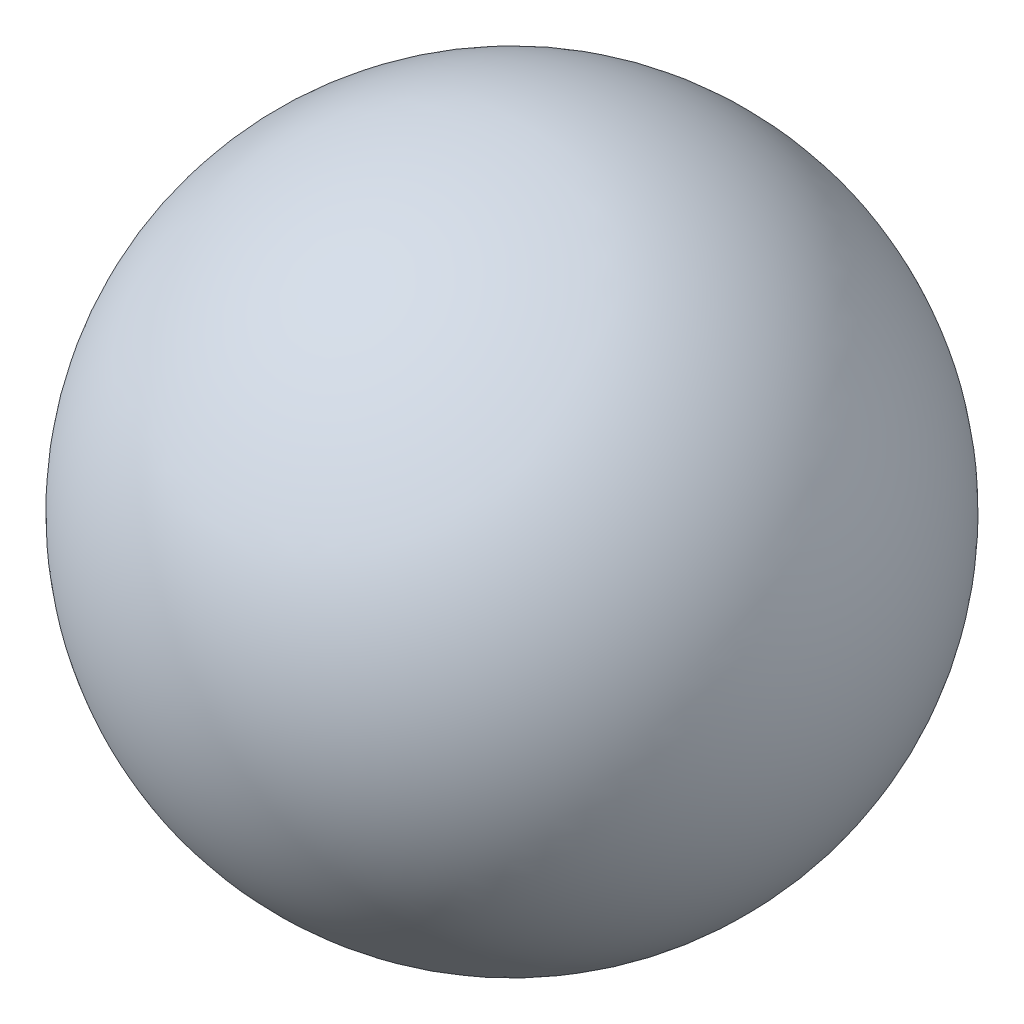
ISO-10303-21;
HEADER;
FILE_DESCRIPTION(('STEP AP214'),'2;1');
FILE_NAME('part.step','',(''),(''),'','','');
FILE_SCHEMA(('AUTOMOTIVE_DESIGN { 1 0 10303 214 1 1 1 1 }'));
ENDSEC;
DATA;
#1=APPLICATION_CONTEXT('core data for automotive mechanical design processes');
#2=APPLICATION_PROTOCOL_DEFINITION('international standard','automotive_design',2000,#1);
#3=PRODUCT_CONTEXT('',#1,'mechanical');
#4=PRODUCT('Part','Part','',(#3));
#5=PRODUCT_RELATED_PRODUCT_CATEGORY('part','',(#4));
#6=PRODUCT_DEFINITION_FORMATION('','',#4);
#7=PRODUCT_DEFINITION_CONTEXT('part definition',#1,'design');
#8=PRODUCT_DEFINITION('design','',#6,#7);
#9=PRODUCT_DEFINITION_SHAPE('','',#8);
#10=(LENGTH_UNIT() NAMED_UNIT(*) SI_UNIT(.MILLI.,.METRE.));
#11=(NAMED_UNIT(*) PLANE_ANGLE_UNIT() SI_UNIT($,.RADIAN.));
#12=(NAMED_UNIT(*) SI_UNIT($,.STERADIAN.) SOLID_ANGLE_UNIT());
#13=UNCERTAINTY_MEASURE_WITH_UNIT(LENGTH_MEASURE(1.E-05),#10,'distance_accuracy_value','');
#14=(GEOMETRIC_REPRESENTATION_CONTEXT(3) GLOBAL_UNCERTAINTY_ASSIGNED_CONTEXT((#13)) GLOBAL_UNIT_ASSIGNED_CONTEXT((#10,
#11,#12)) REPRESENTATION_CONTEXT('',''));
#15=CARTESIAN_POINT('',(0.,0.,0.));
#16=DIRECTION('',(0.,0.,1.));
#17=DIRECTION('',(1.,0.,0.));
#18=AXIS2_PLACEMENT_3D('',#15,#16,#17);
#19=CARTESIAN_POINT('',(0.,0.,0.));
#20=DIRECTION('',(0.,0.,-1.));
#21=DIRECTION('',(1.,0.,0.));
#22=AXIS2_PLACEMENT_3D('',#19,#20,#21);
#23=SPHERICAL_SURFACE('',#22,21.335);
#24=CARTESIAN_POINT('',(0.,0.,-21.335));
#25=VERTEX_POINT('',#24);
#26=VERTEX_LOOP('',#25);
#27=FACE_BOUND('',#26,.T.);
#28=ADVANCED_FACE('F37',(#27),#23,.T.);
#29=CLOSED_SHELL('',(#28));
#30=MANIFOLD_SOLID_BREP('B2',#29);
#31=ADVANCED_BREP_SHAPE_REPRESENTATION('',(#18,#30),#14);
#32=SHAPE_DEFINITION_REPRESENTATION(#9,#31);
ENDSEC;
END-ISO-10303-21;
